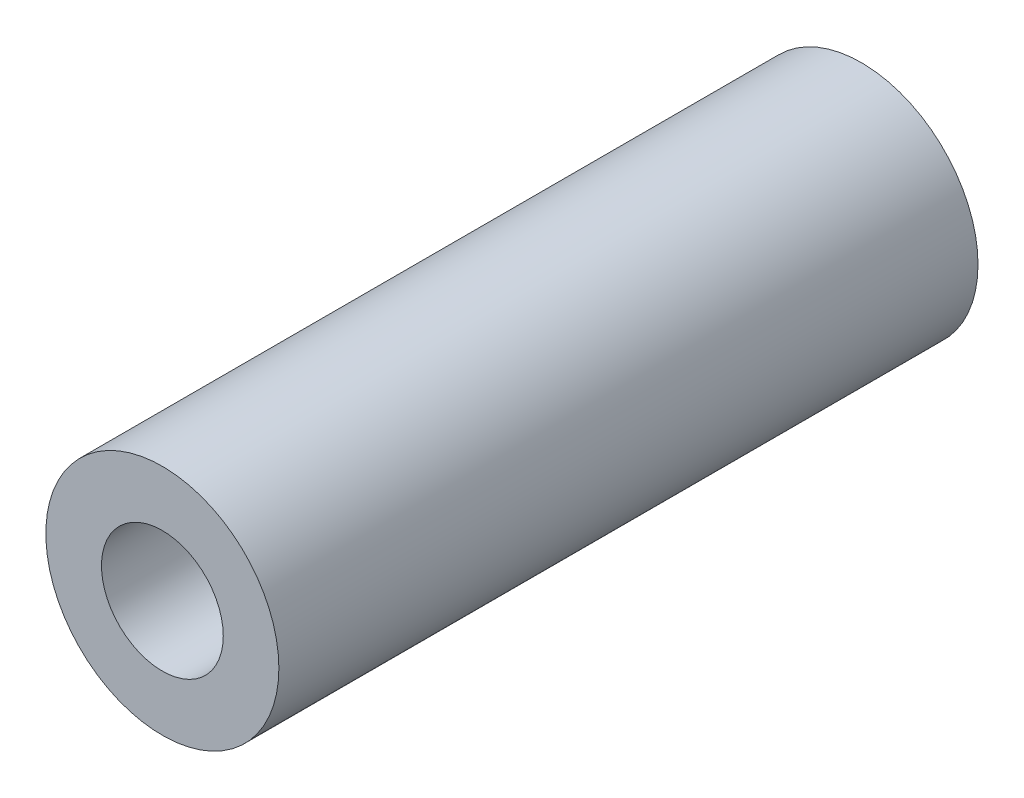
ISO-10303-21;
HEADER;
FILE_DESCRIPTION(('STEP AP214'),'2;1');
FILE_NAME('part.step','',(''),(''),'','','');
FILE_SCHEMA(('AUTOMOTIVE_DESIGN { 1 0 10303 214 1 1 1 1 }'));
ENDSEC;
DATA;
#1=APPLICATION_CONTEXT('core data for automotive mechanical design processes');
#2=APPLICATION_PROTOCOL_DEFINITION('international standard','automotive_design',2000,#1);
#3=PRODUCT_CONTEXT('',#1,'mechanical');
#4=PRODUCT('Part','Part','',(#3));
#5=PRODUCT_RELATED_PRODUCT_CATEGORY('part','',(#4));
#6=PRODUCT_DEFINITION_FORMATION('','',#4);
#7=PRODUCT_DEFINITION_CONTEXT('part definition',#1,'design');
#8=PRODUCT_DEFINITION('design','',#6,#7);
#9=PRODUCT_DEFINITION_SHAPE('','',#8);
#10=(LENGTH_UNIT() NAMED_UNIT(*) SI_UNIT(.MILLI.,.METRE.));
#11=(NAMED_UNIT(*) PLANE_ANGLE_UNIT() SI_UNIT($,.RADIAN.));
#12=(NAMED_UNIT(*) SI_UNIT($,.STERADIAN.) SOLID_ANGLE_UNIT());
#13=UNCERTAINTY_MEASURE_WITH_UNIT(LENGTH_MEASURE(1.E-05),#10,'distance_accuracy_value','');
#14=(GEOMETRIC_REPRESENTATION_CONTEXT(3) GLOBAL_UNCERTAINTY_ASSIGNED_CONTEXT((#13)) GLOBAL_UNIT_ASSIGNED_CONTEXT((#10,
#11,#12)) REPRESENTATION_CONTEXT('',''));
#15=CARTESIAN_POINT('',(0.,0.,0.));
#16=DIRECTION('',(0.,0.,1.));
#17=DIRECTION('',(1.,0.,0.));
#18=AXIS2_PLACEMENT_3D('',#15,#16,#17);
#19=CARTESIAN_POINT('',(-126.845846883905,144.36719939503,28.575));
#20=DIRECTION('',(0.,0.,1.));
#21=DIRECTION('',(1.,0.,0.));
#22=AXIS2_PLACEMENT_3D('',#19,#20,#21);
#23=PLANE('',#22);
#24=CARTESIAN_POINT('',(-126.845846883905,144.36719939503,28.575));
#25=DIRECTION('',(0.,0.,1.));
#26=DIRECTION('',(1.,0.,0.));
#27=AXIS2_PLACEMENT_3D('',#24,#25,#26);
#28=CIRCLE('',#27,4.7625);
#29=CARTESIAN_POINT('',(-122.083346883905,144.36719939503,28.575));
#30=VERTEX_POINT('',#29);
#31=EDGE_CURVE('E10',#30,#30,#28,.T.);
#32=ORIENTED_EDGE('',*,*,#31,.T.);
#33=EDGE_LOOP('',(#32));
#34=FACE_BOUND('',#33,.T.);
#35=CARTESIAN_POINT('',(-126.845846883905,144.36719939503,28.575));
#36=DIRECTION('',(0.,0.,1.));
#37=DIRECTION('',(1.,0.,0.));
#38=AXIS2_PLACEMENT_3D('',#35,#36,#37);
#39=CIRCLE('',#38,2.48920000000002);
#40=CARTESIAN_POINT('',(-124.356646883905,144.36719939503,28.575));
#41=VERTEX_POINT('',#40);
#42=EDGE_CURVE('E46',#41,#41,#39,.T.);
#43=ORIENTED_EDGE('',*,*,#42,.F.);
#44=EDGE_LOOP('',(#43));
#45=FACE_BOUND('',#44,.T.);
#46=ADVANCED_FACE('F35',(#34,#45),#23,.T.);
#47=CARTESIAN_POINT('',(-126.845846883905,144.36719939503,0.));
#48=DIRECTION('',(0.,0.,1.));
#49=DIRECTION('',(1.,0.,0.));
#50=AXIS2_PLACEMENT_3D('',#47,#48,#49);
#51=PLANE('',#50);
#52=CARTESIAN_POINT('',(-126.845846883905,144.36719939503,0.));
#53=DIRECTION('',(0.,0.,1.));
#54=DIRECTION('',(1.,0.,0.));
#55=AXIS2_PLACEMENT_3D('',#52,#53,#54);
#56=CIRCLE('',#55,4.7625);
#57=CARTESIAN_POINT('',(-122.083346883905,144.36719939503,0.));
#58=VERTEX_POINT('',#57);
#59=EDGE_CURVE('E39',#58,#58,#56,.T.);
#60=ORIENTED_EDGE('',*,*,#59,.F.);
#61=EDGE_LOOP('',(#60));
#62=FACE_BOUND('',#61,.T.);
#63=CARTESIAN_POINT('',(-126.845846883905,144.36719939503,0.));
#64=DIRECTION('',(0.,0.,1.));
#65=DIRECTION('',(1.,0.,0.));
#66=AXIS2_PLACEMENT_3D('',#63,#64,#65);
#67=CIRCLE('',#66,2.48920000000002);
#68=CARTESIAN_POINT('',(-124.356646883905,144.36719939503,0.));
#69=VERTEX_POINT('',#68);
#70=EDGE_CURVE('E48',#69,#69,#67,.T.);
#71=ORIENTED_EDGE('',*,*,#70,.T.);
#72=EDGE_LOOP('',(#71));
#73=FACE_BOUND('',#72,.T.);
#74=ADVANCED_FACE('F58',(#62,#73),#51,.F.);
#75=CARTESIAN_POINT('',(-126.845846883905,144.36719939503,28.575));
#76=DIRECTION('',(0.,0.,-1.));
#77=DIRECTION('',(-1.,0.,0.));
#78=AXIS2_PLACEMENT_3D('',#75,#76,#77);
#79=CYLINDRICAL_SURFACE('',#78,4.7625);
#80=ORIENTED_EDGE('',*,*,#31,.F.);
#81=EDGE_LOOP('',(#80));
#82=FACE_BOUND('',#81,.T.);
#83=ORIENTED_EDGE('',*,*,#59,.T.);
#84=EDGE_LOOP('',(#83));
#85=FACE_BOUND('',#84,.T.);
#86=ADVANCED_FACE('F37',(#82,#85),#79,.T.);
#87=CARTESIAN_POINT('',(-126.845846883905,144.36719939503,28.575));
#88=DIRECTION('',(0.,0.,-1.));
#89=DIRECTION('',(-1.,0.,0.));
#90=AXIS2_PLACEMENT_3D('',#87,#88,#89);
#91=CYLINDRICAL_SURFACE('',#90,2.48920000000002);
#92=ORIENTED_EDGE('',*,*,#42,.T.);
#93=EDGE_LOOP('',(#92));
#94=FACE_BOUND('',#93,.T.);
#95=ORIENTED_EDGE('',*,*,#70,.F.);
#96=EDGE_LOOP('',(#95));
#97=FACE_BOUND('',#96,.T.);
#98=ADVANCED_FACE('F54',(#94,#97),#91,.F.);
#99=CLOSED_SHELL('',(#46,#74,#86,#98));
#100=MANIFOLD_SOLID_BREP('B2',#99);
#101=ADVANCED_BREP_SHAPE_REPRESENTATION('',(#18,#100),#14);
#102=SHAPE_DEFINITION_REPRESENTATION(#9,#101);
ENDSEC;
END-ISO-10303-21;
